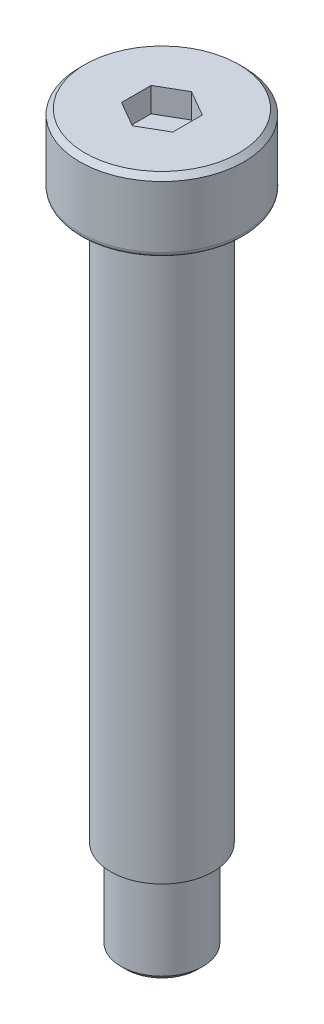
ISO-10303-21;
HEADER;
FILE_DESCRIPTION(('STEP AP214'),'2;1');
FILE_NAME('part.step','',(''),(''),'','','');
FILE_SCHEMA(('AUTOMOTIVE_DESIGN { 1 0 10303 214 1 1 1 1 }'));
ENDSEC;
DATA;
#1=APPLICATION_CONTEXT('core data for automotive mechanical design processes');
#2=APPLICATION_PROTOCOL_DEFINITION('international standard','automotive_design',2000,#1);
#3=PRODUCT_CONTEXT('',#1,'mechanical');
#4=PRODUCT('Part','Part','',(#3));
#5=PRODUCT_RELATED_PRODUCT_CATEGORY('part','',(#4));
#6=PRODUCT_DEFINITION_FORMATION('','',#4);
#7=PRODUCT_DEFINITION_CONTEXT('part definition',#1,'design');
#8=PRODUCT_DEFINITION('design','',#6,#7);
#9=PRODUCT_DEFINITION_SHAPE('','',#8);
#10=(LENGTH_UNIT() NAMED_UNIT(*) SI_UNIT(.MILLI.,.METRE.));
#11=(NAMED_UNIT(*) PLANE_ANGLE_UNIT() SI_UNIT($,.RADIAN.));
#12=(NAMED_UNIT(*) SI_UNIT($,.STERADIAN.) SOLID_ANGLE_UNIT());
#13=UNCERTAINTY_MEASURE_WITH_UNIT(LENGTH_MEASURE(1.E-05),#10,'distance_accuracy_value','');
#14=(GEOMETRIC_REPRESENTATION_CONTEXT(3) GLOBAL_UNCERTAINTY_ASSIGNED_CONTEXT((#13)) GLOBAL_UNIT_ASSIGNED_CONTEXT((#10,
#11,#12)) REPRESENTATION_CONTEXT('',''));
#15=CARTESIAN_POINT('',(0.,0.,0.));
#16=DIRECTION('',(0.,0.,1.));
#17=DIRECTION('',(1.,0.,0.));
#18=AXIS2_PLACEMENT_3D('',#15,#16,#17);
#19=CARTESIAN_POINT('',(0.,0.,0.));
#20=DIRECTION('',(0.,-1.,0.));
#21=DIRECTION('',(1.,0.,0.));
#22=AXIS2_PLACEMENT_3D('',#19,#20,#21);
#23=PLANE('',#22);
#24=CARTESIAN_POINT('',(0.,0.,0.));
#25=DIRECTION('',(0.,-1.,0.));
#26=DIRECTION('',(1.,0.,0.));
#27=AXIS2_PLACEMENT_3D('',#24,#25,#26);
#28=CIRCLE('',#27,7.49999999999999);
#29=CARTESIAN_POINT('',(7.49999999999999,0.,0.));
#30=VERTEX_POINT('',#29);
#31=EDGE_CURVE('E191',#30,#30,#28,.F.);
#32=ORIENTED_EDGE('',*,*,#31,.T.);
#33=EDGE_LOOP('',(#32));
#34=FACE_BOUND('',#33,.T.);
#35=DIRECTION('',(0.866025403784439,0.,-0.5));
#36=VECTOR('',#35,1.);
#37=CARTESIAN_POINT('',(0.,0.,2.88675134594813));
#38=LINE('',#37,#36);
#39=CARTESIAN_POINT('',(0.,0.,2.88675134594813));
#40=VERTEX_POINT('',#39);
#41=CARTESIAN_POINT('',(2.5,0.,1.44337567297407));
#42=VERTEX_POINT('',#41);
#43=EDGE_CURVE('E143',#40,#42,#38,.T.);
#44=ORIENTED_EDGE('',*,*,#43,.F.);
#45=DIRECTION('',(0.866025403784439,0.,0.5));
#46=VECTOR('',#45,1.);
#47=CARTESIAN_POINT('',(-2.5,0.,1.44337567297406));
#48=LINE('',#47,#46);
#49=CARTESIAN_POINT('',(-2.5,0.,1.44337567297406));
#50=VERTEX_POINT('',#49);
#51=EDGE_CURVE('E62',#50,#40,#48,.T.);
#52=ORIENTED_EDGE('',*,*,#51,.F.);
#53=DIRECTION('',(0.,0.,1.));
#54=VECTOR('',#53,1.);
#55=CARTESIAN_POINT('',(-2.5,0.,-1.44337567297407));
#56=LINE('',#55,#54);
#57=CARTESIAN_POINT('',(-2.5,0.,-1.44337567297407));
#58=VERTEX_POINT('',#57);
#59=EDGE_CURVE('E156',#58,#50,#56,.T.);
#60=ORIENTED_EDGE('',*,*,#59,.F.);
#61=DIRECTION('',(-0.866025403784439,0.,0.5));
#62=VECTOR('',#61,1.);
#63=CARTESIAN_POINT('',(0.,0.,-2.88675134594813));
#64=LINE('',#63,#62);
#65=CARTESIAN_POINT('',(0.,0.,-2.88675134594813));
#66=VERTEX_POINT('',#65);
#67=EDGE_CURVE('E153',#66,#58,#64,.T.);
#68=ORIENTED_EDGE('',*,*,#67,.F.);
#69=DIRECTION('',(-0.866025403784439,0.,-0.5));
#70=VECTOR('',#69,1.);
#71=CARTESIAN_POINT('',(2.5,0.,-1.44337567297407));
#72=LINE('',#71,#70);
#73=CARTESIAN_POINT('',(2.5,0.,-1.44337567297407));
#74=VERTEX_POINT('',#73);
#75=EDGE_CURVE('E110',#74,#66,#72,.T.);
#76=ORIENTED_EDGE('',*,*,#75,.F.);
#77=DIRECTION('',(0.,0.,-1.));
#78=VECTOR('',#77,1.);
#79=CARTESIAN_POINT('',(2.5,0.,1.44337567297407));
#80=LINE('',#79,#78);
#81=EDGE_CURVE('E147',#42,#74,#80,.T.);
#82=ORIENTED_EDGE('',*,*,#81,.F.);
#83=EDGE_LOOP('',(#44,#52,#60,#68,#76,#82));
#84=FACE_BOUND('',#83,.T.);
#85=ADVANCED_FACE('F45',(#34,#84),#23,.F.);
#86=CARTESIAN_POINT('',(0.,5.,0.));
#87=DIRECTION('',(0.,1.,0.));
#88=DIRECTION('',(-1.,0.,0.));
#89=AXIS2_PLACEMENT_3D('',#86,#87,#88);
#90=CYLINDRICAL_SURFACE('',#89,8.);
#91=CARTESIAN_POINT('',(0.,-6.50000000000001,0.));
#92=DIRECTION('',(0.,1.,0.));
#93=DIRECTION('',(-1.,0.,0.));
#94=AXIS2_PLACEMENT_3D('',#91,#92,#93);
#95=CIRCLE('',#94,8.);
#96=CARTESIAN_POINT('',(-8.,-6.50000000000001,0.));
#97=VERTEX_POINT('',#96);
#98=EDGE_CURVE('E199',#97,#97,#95,.T.);
#99=ORIENTED_EDGE('',*,*,#98,.T.);
#100=EDGE_LOOP('',(#99));
#101=FACE_BOUND('',#100,.T.);
#102=CARTESIAN_POINT('',(0.,-0.500000000000012,0.));
#103=DIRECTION('',(0.,-1.,0.));
#104=DIRECTION('',(1.,0.,0.));
#105=AXIS2_PLACEMENT_3D('',#102,#103,#104);
#106=CIRCLE('',#105,8.);
#107=CARTESIAN_POINT('',(8.,-0.500000000000011,0.));
#108=VERTEX_POINT('',#107);
#109=EDGE_CURVE('E195',#108,#108,#106,.T.);
#110=ORIENTED_EDGE('',*,*,#109,.T.);
#111=EDGE_LOOP('',(#110));
#112=FACE_BOUND('',#111,.T.);
#113=ADVANCED_FACE('F225',(#101,#112),#90,.T.);
#114=CARTESIAN_POINT('',(8.00000000000001,-7.,0.));
#115=DIRECTION('',(0.,1.,0.));
#116=DIRECTION('',(-1.,0.,0.));
#117=AXIS2_PLACEMENT_3D('',#114,#115,#116);
#118=PLANE('',#117);
#119=CARTESIAN_POINT('',(0.,-7.,0.));
#120=DIRECTION('',(0.,1.,0.));
#121=DIRECTION('',(-1.,0.,0.));
#122=AXIS2_PLACEMENT_3D('',#119,#120,#121);
#123=CIRCLE('',#122,7.5);
#124=CARTESIAN_POINT('',(-7.5,-7.00000000000001,0.));
#125=VERTEX_POINT('',#124);
#126=EDGE_CURVE('E203',#125,#125,#123,.F.);
#127=ORIENTED_EDGE('',*,*,#126,.T.);
#128=EDGE_LOOP('',(#127));
#129=FACE_BOUND('',#128,.T.);
#130=CARTESIAN_POINT('',(0.,-7.00000000000001,0.));
#131=DIRECTION('',(0.,1.,0.));
#132=DIRECTION('',(-1.,0.,0.));
#133=AXIS2_PLACEMENT_3D('',#130,#131,#132);
#134=CIRCLE('',#133,4.75);
#135=CARTESIAN_POINT('',(-4.75,-7.00000000000001,0.));
#136=VERTEX_POINT('',#135);
#137=EDGE_CURVE('E187',#136,#136,#134,.T.);
#138=ORIENTED_EDGE('',*,*,#137,.T.);
#139=EDGE_LOOP('',(#138));
#140=FACE_BOUND('',#139,.T.);
#141=ADVANCED_FACE('F233',(#129,#140),#118,.F.);
#142=CARTESIAN_POINT('',(0.,5.,0.));
#143=DIRECTION('',(0.,1.,0.));
#144=DIRECTION('',(-1.,0.,0.));
#145=AXIS2_PLACEMENT_3D('',#142,#143,#144);
#146=CYLINDRICAL_SURFACE('',#145,4.75);
#147=ORIENTED_EDGE('',*,*,#137,.F.);
#148=EDGE_LOOP('',(#147));
#149=FACE_BOUND('',#148,.T.);
#150=CARTESIAN_POINT('',(0.,-7.50000000000001,0.));
#151=DIRECTION('',(0.,1.,0.));
#152=DIRECTION('',(-1.,0.,0.));
#153=AXIS2_PLACEMENT_3D('',#150,#151,#152);
#154=CIRCLE('',#153,4.75);
#155=CARTESIAN_POINT('',(-4.75,-7.50000000000001,0.));
#156=VERTEX_POINT('',#155);
#157=EDGE_CURVE('E183',#156,#156,#154,.T.);
#158=ORIENTED_EDGE('',*,*,#157,.T.);
#159=EDGE_LOOP('',(#158));
#160=FACE_BOUND('',#159,.T.);
#161=ADVANCED_FACE('F287',(#149,#160),#146,.T.);
#162=CARTESIAN_POINT('',(4.75,-7.50000000000001,0.));
#163=DIRECTION('',(0.,-1.,0.));
#164=DIRECTION('',(1.,0.,0.));
#165=AXIS2_PLACEMENT_3D('',#162,#163,#164);
#166=PLANE('',#165);
#167=ORIENTED_EDGE('',*,*,#157,.F.);
#168=EDGE_LOOP('',(#167));
#169=FACE_BOUND('',#168,.T.);
#170=CARTESIAN_POINT('',(0.,-7.50000000000001,0.));
#171=DIRECTION('',(0.,1.,0.));
#172=DIRECTION('',(-1.,0.,0.));
#173=AXIS2_PLACEMENT_3D('',#170,#171,#172);
#174=CIRCLE('',#173,5.);
#175=CARTESIAN_POINT('',(-5.,-7.50000000000001,0.));
#176=VERTEX_POINT('',#175);
#177=EDGE_CURVE('E179',#176,#176,#174,.T.);
#178=ORIENTED_EDGE('',*,*,#177,.T.);
#179=EDGE_LOOP('',(#178));
#180=FACE_BOUND('',#179,.T.);
#181=ADVANCED_FACE('F283',(#169,#180),#166,.F.);
#182=CARTESIAN_POINT('',(0.,5.,0.));
#183=DIRECTION('',(0.,1.,0.));
#184=DIRECTION('',(-1.,0.,0.));
#185=AXIS2_PLACEMENT_3D('',#182,#183,#184);
#186=CYLINDRICAL_SURFACE('',#185,5.00000000000001);
#187=ORIENTED_EDGE('',*,*,#177,.F.);
#188=EDGE_LOOP('',(#187));
#189=FACE_BOUND('',#188,.T.);
#190=CARTESIAN_POINT('',(0.,-62.,0.));
#191=DIRECTION('',(0.,1.,0.));
#192=DIRECTION('',(-1.,0.,0.));
#193=AXIS2_PLACEMENT_3D('',#190,#191,#192);
#194=CIRCLE('',#193,5.00000000000001);
#195=CARTESIAN_POINT('',(-5.,-62.,0.));
#196=VERTEX_POINT('',#195);
#197=EDGE_CURVE('E175',#196,#196,#194,.T.);
#198=ORIENTED_EDGE('',*,*,#197,.T.);
#199=EDGE_LOOP('',(#198));
#200=FACE_BOUND('',#199,.T.);
#201=ADVANCED_FACE('F279',(#189,#200),#186,.T.);
#202=CARTESIAN_POINT('',(5.00000000000002,-62.,0.));
#203=DIRECTION('',(0.,1.,0.));
#204=DIRECTION('',(-1.,0.,0.));
#205=AXIS2_PLACEMENT_3D('',#202,#203,#204);
#206=PLANE('',#205);
#207=ORIENTED_EDGE('',*,*,#197,.F.);
#208=EDGE_LOOP('',(#207));
#209=FACE_BOUND('',#208,.T.);
#210=CARTESIAN_POINT('',(0.,-62.,0.));
#211=DIRECTION('',(0.,1.,0.));
#212=DIRECTION('',(-1.,0.,0.));
#213=AXIS2_PLACEMENT_3D('',#210,#211,#212);
#214=CIRCLE('',#213,4.);
#215=CARTESIAN_POINT('',(-3.99999999999999,-62.,0.));
#216=VERTEX_POINT('',#215);
#217=EDGE_CURVE('E162',#216,#216,#214,.T.);
#218=ORIENTED_EDGE('',*,*,#217,.T.);
#219=EDGE_LOOP('',(#218));
#220=FACE_BOUND('',#219,.T.);
#221=ADVANCED_FACE('F276',(#209,#220),#206,.F.);
#222=CARTESIAN_POINT('',(0.,5.,0.));
#223=DIRECTION('',(0.,1.,0.));
#224=DIRECTION('',(-1.,0.,0.));
#225=AXIS2_PLACEMENT_3D('',#222,#223,#224);
#226=CYLINDRICAL_SURFACE('',#225,4.);
#227=CARTESIAN_POINT('',(0.,-70.5,0.));
#228=DIRECTION('',(0.,1.,0.));
#229=DIRECTION('',(-1.,0.,0.));
#230=AXIS2_PLACEMENT_3D('',#227,#228,#229);
#231=CIRCLE('',#230,4.);
#232=CARTESIAN_POINT('',(-3.99999999999999,-70.5,0.));
#233=VERTEX_POINT('',#232);
#234=EDGE_CURVE('E55',#233,#233,#231,.T.);
#235=ORIENTED_EDGE('',*,*,#234,.T.);
#236=EDGE_LOOP('',(#235));
#237=FACE_BOUND('',#236,.T.);
#238=ORIENTED_EDGE('',*,*,#217,.F.);
#239=EDGE_LOOP('',(#238));
#240=FACE_BOUND('',#239,.T.);
#241=ADVANCED_FACE('F211',(#237,#240),#226,.T.);
#242=CARTESIAN_POINT('',(4.00000000000001,-71.,0.));
#243=DIRECTION('',(0.,1.,0.));
#244=DIRECTION('',(-1.,0.,0.));
#245=AXIS2_PLACEMENT_3D('',#242,#243,#244);
#246=PLANE('',#245);
#247=CARTESIAN_POINT('',(0.,-71.,0.));
#248=DIRECTION('',(0.,1.,0.));
#249=DIRECTION('',(-1.,0.,0.));
#250=AXIS2_PLACEMENT_3D('',#247,#248,#249);
#251=CIRCLE('',#250,3.50000000000002);
#252=CARTESIAN_POINT('',(-3.50000000000001,-71.,0.));
#253=VERTEX_POINT('',#252);
#254=EDGE_CURVE('E11',#253,#253,#251,.F.);
#255=ORIENTED_EDGE('',*,*,#254,.T.);
#256=EDGE_LOOP('',(#255));
#257=FACE_BOUND('',#256,.T.);
#258=ADVANCED_FACE('F271',(#257),#246,.F.);
#259=CARTESIAN_POINT('',(-2.5,-2.4,1.44337567297406));
#260=DIRECTION('',(-0.5,0.,0.866025403784439));
#261=DIRECTION('',(0.866025403784439,0.,0.5));
#262=AXIS2_PLACEMENT_3D('',#259,#260,#261);
#263=PLANE('',#262);
#264=ORIENTED_EDGE('',*,*,#51,.T.);
#265=DIRECTION('',(0.,1.,0.));
#266=VECTOR('',#265,1.);
#267=CARTESIAN_POINT('',(0.,-2.4,2.88675134594813));
#268=LINE('',#267,#266);
#269=CARTESIAN_POINT('',(0.,-2.4,2.88675134594813));
#270=VERTEX_POINT('',#269);
#271=EDGE_CURVE('E92',#270,#40,#268,.T.);
#272=ORIENTED_EDGE('',*,*,#271,.F.);
#273=DIRECTION('',(0.866025403784439,0.,0.5));
#274=VECTOR('',#273,1.);
#275=CARTESIAN_POINT('',(-2.5,-2.4,1.44337567297406));
#276=LINE('',#275,#274);
#277=CARTESIAN_POINT('',(-2.5,-2.4,1.44337567297406));
#278=VERTEX_POINT('',#277);
#279=EDGE_CURVE('E159',#278,#270,#276,.T.);
#280=ORIENTED_EDGE('',*,*,#279,.F.);
#281=DIRECTION('',(0.,1.,0.));
#282=VECTOR('',#281,1.);
#283=CARTESIAN_POINT('',(-2.5,-2.4,1.44337567297406));
#284=LINE('',#283,#282);
#285=EDGE_CURVE('E70',#278,#50,#284,.T.);
#286=ORIENTED_EDGE('',*,*,#285,.T.);
#287=EDGE_LOOP('',(#264,#272,#280,#286));
#288=FACE_BOUND('',#287,.T.);
#289=ADVANCED_FACE('F261',(#288),#263,.F.);
#290=CARTESIAN_POINT('',(-2.5,-2.4,-1.44337567297407));
#291=DIRECTION('',(-1.,0.,0.));
#292=DIRECTION('',(0.,-1.,0.));
#293=AXIS2_PLACEMENT_3D('',#290,#291,#292);
#294=PLANE('',#293);
#295=ORIENTED_EDGE('',*,*,#59,.T.);
#296=ORIENTED_EDGE('',*,*,#285,.F.);
#297=DIRECTION('',(0.,0.,1.));
#298=VECTOR('',#297,1.);
#299=CARTESIAN_POINT('',(-2.5,-2.4,-1.44337567297407));
#300=LINE('',#299,#298);
#301=CARTESIAN_POINT('',(-2.5,-2.4,-1.44337567297407));
#302=VERTEX_POINT('',#301);
#303=EDGE_CURVE('E124',#302,#278,#300,.T.);
#304=ORIENTED_EDGE('',*,*,#303,.F.);
#305=DIRECTION('',(0.,1.,0.));
#306=VECTOR('',#305,1.);
#307=CARTESIAN_POINT('',(-2.5,-2.4,-1.44337567297407));
#308=LINE('',#307,#306);
#309=EDGE_CURVE('E115',#302,#58,#308,.T.);
#310=ORIENTED_EDGE('',*,*,#309,.T.);
#311=EDGE_LOOP('',(#295,#296,#304,#310));
#312=FACE_BOUND('',#311,.T.);
#313=ADVANCED_FACE('F258',(#312),#294,.F.);
#314=CARTESIAN_POINT('',(0.,-2.4,-2.88675134594813));
#315=DIRECTION('',(-0.5,0.,-0.866025403784439));
#316=DIRECTION('',(-0.866025403784439,0.,0.5));
#317=AXIS2_PLACEMENT_3D('',#314,#315,#316);
#318=PLANE('',#317);
#319=ORIENTED_EDGE('',*,*,#67,.T.);
#320=ORIENTED_EDGE('',*,*,#309,.F.);
#321=DIRECTION('',(-0.866025403784439,0.,0.5));
#322=VECTOR('',#321,1.);
#323=CARTESIAN_POINT('',(0.,-2.4,-2.88675134594813));
#324=LINE('',#323,#322);
#325=CARTESIAN_POINT('',(0.,-2.4,-2.88675134594813));
#326=VERTEX_POINT('',#325);
#327=EDGE_CURVE('E119',#326,#302,#324,.T.);
#328=ORIENTED_EDGE('',*,*,#327,.F.);
#329=DIRECTION('',(0.,1.,0.));
#330=VECTOR('',#329,1.);
#331=CARTESIAN_POINT('',(0.,-2.4,-2.88675134594813));
#332=LINE('',#331,#330);
#333=EDGE_CURVE('E103',#326,#66,#332,.T.);
#334=ORIENTED_EDGE('',*,*,#333,.T.);
#335=EDGE_LOOP('',(#319,#320,#328,#334));
#336=FACE_BOUND('',#335,.T.);
#337=ADVANCED_FACE('F120',(#336),#318,.F.);
#338=CARTESIAN_POINT('',(2.5,-2.4,-1.44337567297407));
#339=DIRECTION('',(0.5,0.,-0.866025403784439));
#340=DIRECTION('',(-0.866025403784439,0.,-0.5));
#341=AXIS2_PLACEMENT_3D('',#338,#339,#340);
#342=PLANE('',#341);
#343=ORIENTED_EDGE('',*,*,#75,.T.);
#344=ORIENTED_EDGE('',*,*,#333,.F.);
#345=DIRECTION('',(-0.866025403784439,0.,-0.5));
#346=VECTOR('',#345,1.);
#347=CARTESIAN_POINT('',(2.5,-2.4,-1.44337567297407));
#348=LINE('',#347,#346);
#349=CARTESIAN_POINT('',(2.5,-2.4,-1.44337567297407));
#350=VERTEX_POINT('',#349);
#351=EDGE_CURVE('E107',#350,#326,#348,.T.);
#352=ORIENTED_EDGE('',*,*,#351,.F.);
#353=DIRECTION('',(0.,1.,0.));
#354=VECTOR('',#353,1.);
#355=CARTESIAN_POINT('',(2.5,-2.4,-1.44337567297407));
#356=LINE('',#355,#354);
#357=EDGE_CURVE('E116',#350,#74,#356,.T.);
#358=ORIENTED_EDGE('',*,*,#357,.T.);
#359=EDGE_LOOP('',(#343,#344,#352,#358));
#360=FACE_BOUND('',#359,.T.);
#361=ADVANCED_FACE('F105',(#360),#342,.F.);
#362=CARTESIAN_POINT('',(2.5,-2.4,1.44337567297407));
#363=DIRECTION('',(1.,0.,0.));
#364=DIRECTION('',(0.,0.,-1.));
#365=AXIS2_PLACEMENT_3D('',#362,#363,#364);
#366=PLANE('',#365);
#367=ORIENTED_EDGE('',*,*,#81,.T.);
#368=ORIENTED_EDGE('',*,*,#357,.F.);
#369=DIRECTION('',(0.,0.,-1.));
#370=VECTOR('',#369,1.);
#371=CARTESIAN_POINT('',(2.5,-2.4,1.44337567297407));
#372=LINE('',#371,#370);
#373=CARTESIAN_POINT('',(2.5,-2.4,1.44337567297407));
#374=VERTEX_POINT('',#373);
#375=EDGE_CURVE('E130',#374,#350,#372,.T.);
#376=ORIENTED_EDGE('',*,*,#375,.F.);
#377=DIRECTION('',(0.,1.,0.));
#378=VECTOR('',#377,1.);
#379=CARTESIAN_POINT('',(2.5,-2.4,1.44337567297407));
#380=LINE('',#379,#378);
#381=EDGE_CURVE('E167',#374,#42,#380,.T.);
#382=ORIENTED_EDGE('',*,*,#381,.T.);
#383=EDGE_LOOP('',(#367,#368,#376,#382));
#384=FACE_BOUND('',#383,.T.);
#385=ADVANCED_FACE('F254',(#384),#366,.F.);
#386=CARTESIAN_POINT('',(0.,-2.4,2.88675134594813));
#387=DIRECTION('',(0.5,0.,0.866025403784439));
#388=DIRECTION('',(0.866025403784439,0.,-0.5));
#389=AXIS2_PLACEMENT_3D('',#386,#387,#388);
#390=PLANE('',#389);
#391=ORIENTED_EDGE('',*,*,#43,.T.);
#392=ORIENTED_EDGE('',*,*,#381,.F.);
#393=DIRECTION('',(0.866025403784439,0.,-0.5));
#394=VECTOR('',#393,1.);
#395=CARTESIAN_POINT('',(0.,-2.4,2.88675134594813));
#396=LINE('',#395,#394);
#397=EDGE_CURVE('E135',#270,#374,#396,.T.);
#398=ORIENTED_EDGE('',*,*,#397,.F.);
#399=ORIENTED_EDGE('',*,*,#271,.T.);
#400=EDGE_LOOP('',(#391,#392,#398,#399));
#401=FACE_BOUND('',#400,.T.);
#402=ADVANCED_FACE('F245',(#401),#390,.F.);
#403=CARTESIAN_POINT('',(0.,-2.4,0.));
#404=DIRECTION('',(0.,1.,0.));
#405=DIRECTION('',(-1.,0.,0.));
#406=AXIS2_PLACEMENT_3D('',#403,#404,#405);
#407=PLANE('',#406);
#408=ORIENTED_EDGE('',*,*,#279,.T.);
#409=ORIENTED_EDGE('',*,*,#397,.T.);
#410=ORIENTED_EDGE('',*,*,#375,.T.);
#411=ORIENTED_EDGE('',*,*,#351,.T.);
#412=ORIENTED_EDGE('',*,*,#327,.T.);
#413=ORIENTED_EDGE('',*,*,#303,.T.);
#414=EDGE_LOOP('',(#408,#409,#410,#411,#412,#413));
#415=FACE_BOUND('',#414,.T.);
#416=ADVANCED_FACE('F127',(#415),#407,.T.);
#417=CARTESIAN_POINT('',(0.,0.,0.));
#418=DIRECTION('',(0.,-1.,0.));
#419=DIRECTION('',(1.,0.,0.));
#420=AXIS2_PLACEMENT_3D('',#417,#418,#419);
#421=CONICAL_SURFACE('',#420,7.49999999999999,0.785398163397448);
#422=ORIENTED_EDGE('',*,*,#109,.F.);
#423=EDGE_LOOP('',(#422));
#424=FACE_BOUND('',#423,.T.);
#425=ORIENTED_EDGE('',*,*,#31,.F.);
#426=EDGE_LOOP('',(#425));
#427=FACE_BOUND('',#426,.T.);
#428=ADVANCED_FACE('F221',(#424,#427),#421,.T.);
#429=CARTESIAN_POINT('',(0.,-6.50000000000001,0.));
#430=DIRECTION('',(0.,1.,0.));
#431=DIRECTION('',(-1.,0.,0.));
#432=AXIS2_PLACEMENT_3D('',#429,#430,#431);
#433=TOROIDAL_SURFACE('',#432,7.5,0.5);
#434=ORIENTED_EDGE('',*,*,#126,.F.);
#435=EDGE_LOOP('',(#434));
#436=FACE_BOUND('',#435,.T.);
#437=ORIENTED_EDGE('',*,*,#98,.F.);
#438=EDGE_LOOP('',(#437));
#439=FACE_BOUND('',#438,.T.);
#440=ADVANCED_FACE('F215',(#436,#439),#433,.T.);
#441=CARTESIAN_POINT('',(0.,-70.5,0.));
#442=DIRECTION('',(0.,1.,0.));
#443=DIRECTION('',(-1.,0.,0.));
#444=AXIS2_PLACEMENT_3D('',#441,#442,#443);
#445=CONICAL_SURFACE('',#444,4.,0.785398163397439);
#446=ORIENTED_EDGE('',*,*,#254,.F.);
#447=EDGE_LOOP('',(#446));
#448=FACE_BOUND('',#447,.T.);
#449=ORIENTED_EDGE('',*,*,#234,.F.);
#450=EDGE_LOOP('',(#449));
#451=FACE_BOUND('',#450,.T.);
#452=ADVANCED_FACE('F48',(#448,#451),#445,.T.);
#453=CLOSED_SHELL('',(#85,#113,#141,#161,#181,#201,#221,#241,#258,#289,#313,#337,#361,#385,#402,
#416,#428,#440,#452));
#454=MANIFOLD_SOLID_BREP('B2',#453);
#455=ADVANCED_BREP_SHAPE_REPRESENTATION('',(#18,#454),#14);
#456=SHAPE_DEFINITION_REPRESENTATION(#9,#455);
ENDSEC;
END-ISO-10303-21;
